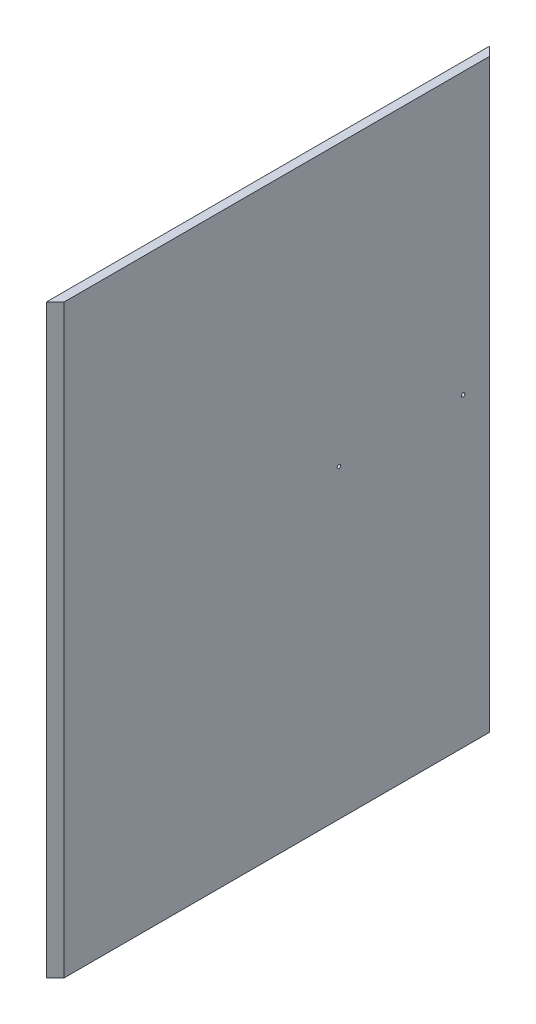
ISO-10303-21;
HEADER;
FILE_DESCRIPTION(('STEP AP214'),'2;1');
FILE_NAME('part.step','',(''),(''),'','','');
FILE_SCHEMA(('AUTOMOTIVE_DESIGN { 1 0 10303 214 1 1 1 1 }'));
ENDSEC;
DATA;
#1=APPLICATION_CONTEXT('core data for automotive mechanical design processes');
#2=APPLICATION_PROTOCOL_DEFINITION('international standard','automotive_design',2000,#1);
#3=PRODUCT_CONTEXT('',#1,'mechanical');
#4=PRODUCT('Part','Part','',(#3));
#5=PRODUCT_RELATED_PRODUCT_CATEGORY('part','',(#4));
#6=PRODUCT_DEFINITION_FORMATION('','',#4);
#7=PRODUCT_DEFINITION_CONTEXT('part definition',#1,'design');
#8=PRODUCT_DEFINITION('design','',#6,#7);
#9=PRODUCT_DEFINITION_SHAPE('','',#8);
#10=(LENGTH_UNIT() NAMED_UNIT(*) SI_UNIT(.MILLI.,.METRE.));
#11=(NAMED_UNIT(*) PLANE_ANGLE_UNIT() SI_UNIT($,.RADIAN.));
#12=(NAMED_UNIT(*) SI_UNIT($,.STERADIAN.) SOLID_ANGLE_UNIT());
#13=UNCERTAINTY_MEASURE_WITH_UNIT(LENGTH_MEASURE(1.E-05),#10,'distance_accuracy_value','');
#14=(GEOMETRIC_REPRESENTATION_CONTEXT(3) GLOBAL_UNCERTAINTY_ASSIGNED_CONTEXT((#13)) GLOBAL_UNIT_ASSIGNED_CONTEXT((#10,
#11,#12)) REPRESENTATION_CONTEXT('',''));
#15=CARTESIAN_POINT('',(0.,0.,0.));
#16=DIRECTION('',(0.,0.,1.));
#17=DIRECTION('',(1.,0.,0.));
#18=AXIS2_PLACEMENT_3D('',#15,#16,#17);
#19=CARTESIAN_POINT('',(0.,330.,0.));
#20=DIRECTION('',(-1.,0.,0.));
#21=DIRECTION('',(0.,0.,1.));
#22=AXIS2_PLACEMENT_3D('',#19,#20,#21);
#23=PLANE('',#22);
#24=CARTESIAN_POINT('',(0.,172.2,-230.));
#25=DIRECTION('',(-1.,0.,0.));
#26=DIRECTION('',(0.,0.,1.));
#27=AXIS2_PLACEMENT_3D('',#24,#25,#26);
#28=CIRCLE('',#27,0.999999999999998);
#29=CARTESIAN_POINT('',(0.,172.2,-229.));
#30=VERTEX_POINT('',#29);
#31=EDGE_CURVE('E105',#30,#30,#28,.F.);
#32=ORIENTED_EDGE('',*,*,#31,.F.);
#33=EDGE_LOOP('',(#32));
#34=FACE_BOUND('',#33,.T.);
#35=CARTESIAN_POINT('',(0.,172.2,-160.));
#36=DIRECTION('',(-1.,0.,0.));
#37=DIRECTION('',(0.,0.,1.));
#38=AXIS2_PLACEMENT_3D('',#35,#36,#37);
#39=CIRCLE('',#38,0.999999999999998);
#40=CARTESIAN_POINT('',(0.,172.2,-159.));
#41=VERTEX_POINT('',#40);
#42=EDGE_CURVE('E109',#41,#41,#39,.F.);
#43=ORIENTED_EDGE('',*,*,#42,.F.);
#44=EDGE_LOOP('',(#43));
#45=FACE_BOUND('',#44,.T.);
#46=DIRECTION('',(0.,0.,-1.));
#47=VECTOR('',#46,1.);
#48=CARTESIAN_POINT('',(0.,0.,0.));
#49=LINE('',#48,#47);
#50=CARTESIAN_POINT('',(0.,0.,-5.));
#51=VERTEX_POINT('',#50);
#52=CARTESIAN_POINT('',(0.,0.,-245.));
#53=VERTEX_POINT('',#52);
#54=EDGE_CURVE('E80',#51,#53,#49,.T.);
#55=ORIENTED_EDGE('',*,*,#54,.T.);
#56=DIRECTION('',(0.,1.,0.));
#57=VECTOR('',#56,1.);
#58=CARTESIAN_POINT('',(0.,-0.000999999999973245,-245.));
#59=LINE('',#58,#57);
#60=CARTESIAN_POINT('',(0.,330.,-245.));
#61=VERTEX_POINT('',#60);
#62=EDGE_CURVE('E51',#53,#61,#59,.T.);
#63=ORIENTED_EDGE('',*,*,#62,.T.);
#64=DIRECTION('',(0.,0.,-1.));
#65=VECTOR('',#64,1.);
#66=CARTESIAN_POINT('',(0.,330.,0.));
#67=LINE('',#66,#65);
#68=CARTESIAN_POINT('',(0.,330.,-5.));
#69=VERTEX_POINT('',#68);
#70=EDGE_CURVE('E91',#69,#61,#67,.T.);
#71=ORIENTED_EDGE('',*,*,#70,.F.);
#72=DIRECTION('',(0.,1.,0.));
#73=VECTOR('',#72,1.);
#74=CARTESIAN_POINT('',(0.,-0.000999999999973245,-5.));
#75=LINE('',#74,#73);
#76=EDGE_CURVE('E100',#51,#69,#75,.T.);
#77=ORIENTED_EDGE('',*,*,#76,.F.);
#78=EDGE_LOOP('',(#55,#63,#71,#77));
#79=FACE_BOUND('',#78,.T.);
#80=ADVANCED_FACE('F37',(#34,#45,#79),#23,.F.);
#81=CARTESIAN_POINT('',(-5.,330.,-250.));
#82=DIRECTION('',(1.,0.,0.));
#83=DIRECTION('',(0.,0.,-1.));
#84=AXIS2_PLACEMENT_3D('',#81,#82,#83);
#85=PLANE('',#84);
#86=CARTESIAN_POINT('',(-5.,172.2,-230.));
#87=DIRECTION('',(-1.,0.,0.));
#88=DIRECTION('',(0.,0.,1.));
#89=AXIS2_PLACEMENT_3D('',#86,#87,#88);
#90=CIRCLE('',#89,0.999999999999998);
#91=CARTESIAN_POINT('',(-5.,172.2,-229.));
#92=VERTEX_POINT('',#91);
#93=EDGE_CURVE('E112',#92,#92,#90,.T.);
#94=ORIENTED_EDGE('',*,*,#93,.F.);
#95=EDGE_LOOP('',(#94));
#96=FACE_BOUND('',#95,.T.);
#97=CARTESIAN_POINT('',(-4.99999999999999,172.2,-160.));
#98=DIRECTION('',(-1.,0.,0.));
#99=DIRECTION('',(0.,0.,1.));
#100=AXIS2_PLACEMENT_3D('',#97,#98,#99);
#101=CIRCLE('',#100,0.999999999999998);
#102=CARTESIAN_POINT('',(-4.99999999999999,172.2,-159.));
#103=VERTEX_POINT('',#102);
#104=EDGE_CURVE('E113',#103,#103,#101,.T.);
#105=ORIENTED_EDGE('',*,*,#104,.F.);
#106=EDGE_LOOP('',(#105));
#107=FACE_BOUND('',#106,.T.);
#108=DIRECTION('',(0.,0.,1.));
#109=VECTOR('',#108,1.);
#110=CARTESIAN_POINT('',(-5.,0.,-250.));
#111=LINE('',#110,#109);
#112=CARTESIAN_POINT('',(-5.,0.,-250.));
#113=VERTEX_POINT('',#112);
#114=CARTESIAN_POINT('',(-4.99999999999997,0.,0.));
#115=VERTEX_POINT('',#114);
#116=EDGE_CURVE('E86',#113,#115,#111,.T.);
#117=ORIENTED_EDGE('',*,*,#116,.T.);
#118=DIRECTION('',(0.,-1.,0.));
#119=VECTOR('',#118,1.);
#120=CARTESIAN_POINT('',(-4.99999999999997,330.,0.));
#121=LINE('',#120,#119);
#122=CARTESIAN_POINT('',(-4.99999999999997,330.,0.));
#123=VERTEX_POINT('',#122);
#124=EDGE_CURVE('E44',#123,#115,#121,.T.);
#125=ORIENTED_EDGE('',*,*,#124,.F.);
#126=DIRECTION('',(0.,0.,1.));
#127=VECTOR('',#126,1.);
#128=CARTESIAN_POINT('',(-5.,330.,-250.));
#129=LINE('',#128,#127);
#130=CARTESIAN_POINT('',(-5.,330.,-250.));
#131=VERTEX_POINT('',#130);
#132=EDGE_CURVE('E88',#131,#123,#129,.T.);
#133=ORIENTED_EDGE('',*,*,#132,.F.);
#134=DIRECTION('',(0.,-1.,0.));
#135=VECTOR('',#134,1.);
#136=CARTESIAN_POINT('',(-5.,330.,-250.));
#137=LINE('',#136,#135);
#138=EDGE_CURVE('E11',#131,#113,#137,.T.);
#139=ORIENTED_EDGE('',*,*,#138,.T.);
#140=EDGE_LOOP('',(#117,#125,#133,#139));
#141=FACE_BOUND('',#140,.T.);
#142=ADVANCED_FACE('F85',(#96,#107,#141),#85,.F.);
#143=CARTESIAN_POINT('',(0.,330.,0.));
#144=DIRECTION('',(0.,1.,0.));
#145=DIRECTION('',(0.,0.,1.));
#146=AXIS2_PLACEMENT_3D('',#143,#144,#145);
#147=PLANE('',#146);
#148=DIRECTION('',(0.707106781186547,0.,0.707106781186548));
#149=VECTOR('',#148,1.);
#150=CARTESIAN_POINT('',(0.,330.,-245.));
#151=LINE('',#150,#149);
#152=EDGE_CURVE('E102',#131,#61,#151,.T.);
#153=ORIENTED_EDGE('',*,*,#152,.F.);
#154=ORIENTED_EDGE('',*,*,#132,.T.);
#155=DIRECTION('',(-0.707106781186545,0.,0.70710678118655));
#156=VECTOR('',#155,1.);
#157=CARTESIAN_POINT('',(-4.99999999999997,330.,0.));
#158=LINE('',#157,#156);
#159=EDGE_CURVE('E103',#69,#123,#158,.T.);
#160=ORIENTED_EDGE('',*,*,#159,.F.);
#161=ORIENTED_EDGE('',*,*,#70,.T.);
#162=EDGE_LOOP('',(#153,#154,#160,#161));
#163=FACE_BOUND('',#162,.T.);
#164=ADVANCED_FACE('F126',(#163),#147,.T.);
#165=CARTESIAN_POINT('',(0.,0.,0.));
#166=DIRECTION('',(0.,1.,0.));
#167=DIRECTION('',(0.,0.,1.));
#168=AXIS2_PLACEMENT_3D('',#165,#166,#167);
#169=PLANE('',#168);
#170=ORIENTED_EDGE('',*,*,#116,.F.);
#171=DIRECTION('',(-0.707106781186547,0.,-0.707106781186548));
#172=VECTOR('',#171,1.);
#173=CARTESIAN_POINT('',(0.,0.,-245.));
#174=LINE('',#173,#172);
#175=EDGE_CURVE('E73',#53,#113,#174,.T.);
#176=ORIENTED_EDGE('',*,*,#175,.F.);
#177=ORIENTED_EDGE('',*,*,#54,.F.);
#178=DIRECTION('',(0.707106781186545,0.,-0.70710678118655));
#179=VECTOR('',#178,1.);
#180=CARTESIAN_POINT('',(-4.99999999999997,0.,0.));
#181=LINE('',#180,#179);
#182=EDGE_CURVE('E90',#115,#51,#181,.T.);
#183=ORIENTED_EDGE('',*,*,#182,.F.);
#184=EDGE_LOOP('',(#170,#176,#177,#183));
#185=FACE_BOUND('',#184,.T.);
#186=ADVANCED_FACE('F89',(#185),#169,.F.);
#187=CARTESIAN_POINT('',(-4.99999999999997,-0.000999999999973245,0.));
#188=DIRECTION('',(-0.70710678118655,0.,-0.707106781186545));
#189=DIRECTION('',(-0.707106781186545,0.,0.70710678118655));
#190=AXIS2_PLACEMENT_3D('',#187,#188,#189);
#191=PLANE('',#190);
#192=ORIENTED_EDGE('',*,*,#182,.T.);
#193=ORIENTED_EDGE('',*,*,#76,.T.);
#194=ORIENTED_EDGE('',*,*,#159,.T.);
#195=ORIENTED_EDGE('',*,*,#124,.T.);
#196=EDGE_LOOP('',(#192,#193,#194,#195));
#197=FACE_BOUND('',#196,.T.);
#198=ADVANCED_FACE('F140',(#197),#191,.F.);
#199=CARTESIAN_POINT('',(0.,-0.000999999999973245,-245.));
#200=DIRECTION('',(-0.707106781186548,0.,0.707106781186547));
#201=DIRECTION('',(0.707106781186547,0.,0.707106781186548));
#202=AXIS2_PLACEMENT_3D('',#199,#200,#201);
#203=PLANE('',#202);
#204=ORIENTED_EDGE('',*,*,#175,.T.);
#205=ORIENTED_EDGE('',*,*,#138,.F.);
#206=ORIENTED_EDGE('',*,*,#152,.T.);
#207=ORIENTED_EDGE('',*,*,#62,.F.);
#208=EDGE_LOOP('',(#204,#205,#206,#207));
#209=FACE_BOUND('',#208,.T.);
#210=ADVANCED_FACE('F74',(#209),#203,.F.);
#211=CARTESIAN_POINT('',(0.00100000000001228,172.2,-160.));
#212=DIRECTION('',(-1.,0.,0.));
#213=DIRECTION('',(0.,0.,1.));
#214=AXIS2_PLACEMENT_3D('',#211,#212,#213);
#215=CYLINDRICAL_SURFACE('',#214,0.999999999999998);
#216=ORIENTED_EDGE('',*,*,#104,.T.);
#217=EDGE_LOOP('',(#216));
#218=FACE_BOUND('',#217,.T.);
#219=ORIENTED_EDGE('',*,*,#42,.T.);
#220=EDGE_LOOP('',(#219));
#221=FACE_BOUND('',#220,.T.);
#222=ADVANCED_FACE('F129',(#218,#221),#215,.F.);
#223=CARTESIAN_POINT('',(0.0010000000000036,172.2,-230.));
#224=DIRECTION('',(-1.,0.,0.));
#225=DIRECTION('',(0.,0.,1.));
#226=AXIS2_PLACEMENT_3D('',#223,#224,#225);
#227=CYLINDRICAL_SURFACE('',#226,0.999999999999998);
#228=ORIENTED_EDGE('',*,*,#93,.T.);
#229=EDGE_LOOP('',(#228));
#230=FACE_BOUND('',#229,.T.);
#231=ORIENTED_EDGE('',*,*,#31,.T.);
#232=EDGE_LOOP('',(#231));
#233=FACE_BOUND('',#232,.T.);
#234=ADVANCED_FACE('F121',(#230,#233),#227,.F.);
#235=CLOSED_SHELL('',(#80,#142,#164,#186,#198,#210,#222,#234));
#236=MANIFOLD_SOLID_BREP('B2',#235);
#237=ADVANCED_BREP_SHAPE_REPRESENTATION('',(#18,#236),#14);
#238=SHAPE_DEFINITION_REPRESENTATION(#9,#237);
ENDSEC;
END-ISO-10303-21;
